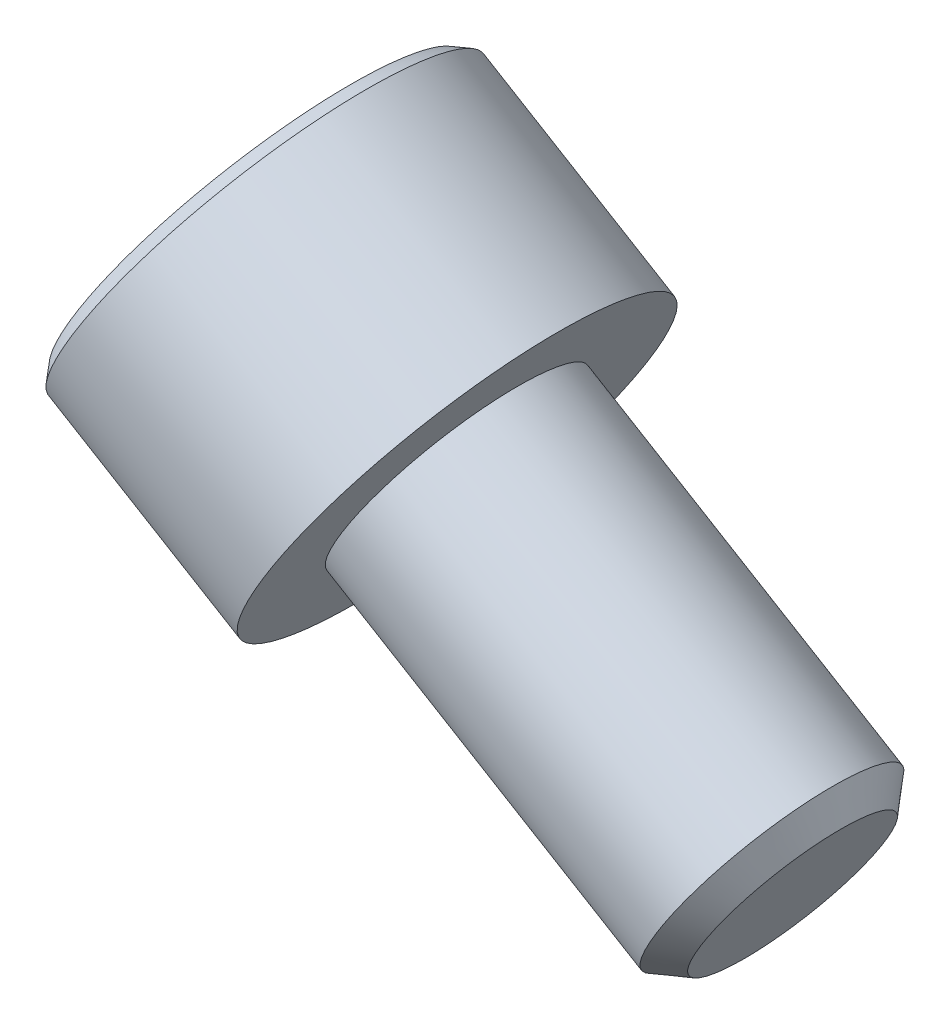
ISO-10303-21;
HEADER;
FILE_DESCRIPTION(('STEP AP214'),'2;1');
FILE_NAME('part.step','',(''),(''),'','','');
FILE_SCHEMA(('AUTOMOTIVE_DESIGN { 1 0 10303 214 1 1 1 1 }'));
ENDSEC;
DATA;
#1=APPLICATION_CONTEXT('core data for automotive mechanical design processes');
#2=APPLICATION_PROTOCOL_DEFINITION('international standard','automotive_design',2000,#1);
#3=PRODUCT_CONTEXT('',#1,'mechanical');
#4=PRODUCT('Part','Part','',(#3));
#5=PRODUCT_RELATED_PRODUCT_CATEGORY('part','',(#4));
#6=PRODUCT_DEFINITION_FORMATION('','',#4);
#7=PRODUCT_DEFINITION_CONTEXT('part definition',#1,'design');
#8=PRODUCT_DEFINITION('design','',#6,#7);
#9=PRODUCT_DEFINITION_SHAPE('','',#8);
#10=(LENGTH_UNIT() NAMED_UNIT(*) SI_UNIT(.MILLI.,.METRE.));
#11=(NAMED_UNIT(*) PLANE_ANGLE_UNIT() SI_UNIT($,.RADIAN.));
#12=(NAMED_UNIT(*) SI_UNIT($,.STERADIAN.) SOLID_ANGLE_UNIT());
#13=UNCERTAINTY_MEASURE_WITH_UNIT(LENGTH_MEASURE(1.E-05),#10,'distance_accuracy_value','');
#14=(GEOMETRIC_REPRESENTATION_CONTEXT(3) GLOBAL_UNCERTAINTY_ASSIGNED_CONTEXT((#13)) GLOBAL_UNIT_ASSIGNED_CONTEXT((#10,
#11,#12)) REPRESENTATION_CONTEXT('',''));
#15=CARTESIAN_POINT('',(0.,0.,0.));
#16=DIRECTION('',(0.,0.,1.));
#17=DIRECTION('',(1.,0.,0.));
#18=AXIS2_PLACEMENT_3D('',#15,#16,#17);
#19=CARTESIAN_POINT('',(-6.01123652224669,-13.8875856603519,0.));
#20=DIRECTION('',(-0.857167300702099,0.515038074910076,0.));
#21=DIRECTION('',(-0.515038074910076,-0.857167300702099,0.));
#22=AXIS2_PLACEMENT_3D('',#19,#20,#21);
#23=PLANE('',#22);
#24=CARTESIAN_POINT('',(-6.0112365222467,-13.887585660352,0.));
#25=DIRECTION('',(-0.857167300702099,0.515038074910076,0.));
#26=DIRECTION('',(-0.515038074910076,-0.857167300702099,0.));
#27=AXIS2_PLACEMENT_3D('',#24,#25,#26);
#28=CIRCLE('',#27,2.38649999999937);
#29=CARTESIAN_POINT('',(-7.24037488801927,-15.933215423477,0.));
#30=VERTEX_POINT('',#29);
#31=EDGE_CURVE('E375',#30,#30,#28,.T.);
#32=ORIENTED_EDGE('',*,*,#31,.F.);
#33=EDGE_LOOP('',(#32));
#34=FACE_BOUND('',#33,.T.);
#35=ADVANCED_FACE('F16',(#34),#23,.F.);
#36=CARTESIAN_POINT('',(-6.01123652224678,-13.8875856603519,0.));
#37=DIRECTION('',(-0.857167300702099,0.515038074910076,0.));
#38=DIRECTION('',(-0.515038074910076,-0.857167300702099,0.));
#39=AXIS2_PLACEMENT_3D('',#36,#37,#38);
#40=CONICAL_SURFACE('',#39,2.38649999999947,0.7853981633981);
#41=CARTESIAN_POINT('',(-6.53710866122728,-13.5716098013947,0.));
#42=DIRECTION('',(-0.857167300702099,0.515038074910076,0.));
#43=DIRECTION('',(-0.515038074910076,-0.857167300702099,0.));
#44=AXIS2_PLACEMENT_3D('',#41,#42,#43);
#45=CIRCLE('',#44,2.99999999999999);
#46=CARTESIAN_POINT('',(-8.08222288595751,-16.143111703501,0.));
#47=VERTEX_POINT('',#46);
#48=EDGE_CURVE('E372',#47,#47,#45,.T.);
#49=ORIENTED_EDGE('',*,*,#48,.F.);
#50=EDGE_LOOP('',(#49));
#51=FACE_BOUND('',#50,.T.);
#52=ORIENTED_EDGE('',*,*,#31,.T.);
#53=EDGE_LOOP('',(#52));
#54=FACE_BOUND('',#53,.T.);
#55=ADVANCED_FACE('F178',(#51,#54),#40,.T.);
#56=CARTESIAN_POINT('',(-19.72591333348,-5.6469764617909,0.));
#57=DIRECTION('',(-0.857167300702099,0.515038074910076,0.));
#58=DIRECTION('',(-0.515038074910076,-0.857167300702099,0.));
#59=AXIS2_PLACEMENT_3D('',#56,#57,#58);
#60=CYLINDRICAL_SURFACE('',#59,3.00000000000024);
#61=CARTESIAN_POINT('',(-14.5829095292675,-8.73720491125129,0.));
#62=DIRECTION('',(-0.857167300702099,0.515038074910076,0.));
#63=DIRECTION('',(-0.515038074910076,-0.857167300702099,0.));
#64=AXIS2_PLACEMENT_3D('',#61,#62,#63);
#65=CIRCLE('',#64,3.00000000000024);
#66=CARTESIAN_POINT('',(-16.1280237539979,-11.3087068133578,0.));
#67=VERTEX_POINT('',#66);
#68=EDGE_CURVE('E367',#67,#67,#65,.T.);
#69=ORIENTED_EDGE('',*,*,#68,.F.);
#70=EDGE_LOOP('',(#69));
#71=FACE_BOUND('',#70,.T.);
#72=ORIENTED_EDGE('',*,*,#48,.T.);
#73=EDGE_LOOP('',(#72));
#74=FACE_BOUND('',#73,.T.);
#75=ADVANCED_FACE('F184',(#71,#74),#60,.T.);
#76=CARTESIAN_POINT('',(-16.128023753998,-11.308706813358,0.));
#77=DIRECTION('',(-0.857167300702099,0.515038074910076,0.));
#78=DIRECTION('',(-0.515038074910076,-0.857167300702099,0.));
#79=AXIS2_PLACEMENT_3D('',#76,#77,#78);
#80=PLANE('',#79);
#81=CARTESIAN_POINT('',(-14.5829095292675,-8.73720491125129,0.));
#82=DIRECTION('',(-0.857167300702099,0.515038074910076,0.));
#83=DIRECTION('',(-0.515038074910076,-0.857167300702099,0.));
#84=AXIS2_PLACEMENT_3D('',#81,#82,#83);
#85=CIRCLE('',#84,5.00000000000043);
#86=CARTESIAN_POINT('',(-17.1580999038181,-13.0230414147622,0.));
#87=VERTEX_POINT('',#86);
#88=EDGE_CURVE('E365',#87,#87,#85,.T.);
#89=ORIENTED_EDGE('',*,*,#88,.F.);
#90=EDGE_LOOP('',(#89));
#91=FACE_BOUND('',#90,.T.);
#92=ORIENTED_EDGE('',*,*,#68,.T.);
#93=EDGE_LOOP('',(#92));
#94=FACE_BOUND('',#93,.T.);
#95=ADVANCED_FACE('F191',(#91,#94),#80,.F.);
#96=CARTESIAN_POINT('',(-19.72591333348,-5.6469764617909,0.));
#97=DIRECTION('',(-0.857167300702099,0.515038074910076,0.));
#98=DIRECTION('',(-0.515038074910076,-0.857167300702099,0.));
#99=AXIS2_PLACEMENT_3D('',#96,#97,#98);
#100=CYLINDRICAL_SURFACE('',#99,5.00000000000043);
#101=CARTESIAN_POINT('',(-19.4687631432693,-5.80148788426397,0.));
#102=DIRECTION('',(-0.857167300702099,0.515038074910076,0.));
#103=DIRECTION('',(-0.515038074910076,-0.857167300702099,0.));
#104=AXIS2_PLACEMENT_3D('',#101,#102,#103);
#105=CIRCLE('',#104,5.00000000000063);
#106=CARTESIAN_POINT('',(-22.04395351782,-10.087324387775,0.));
#107=VERTEX_POINT('',#106);
#108=EDGE_CURVE('E96',#107,#107,#105,.T.);
#109=ORIENTED_EDGE('',*,*,#108,.F.);
#110=EDGE_LOOP('',(#109));
#111=FACE_BOUND('',#110,.T.);
#112=ORIENTED_EDGE('',*,*,#88,.T.);
#113=EDGE_LOOP('',(#112));
#114=FACE_BOUND('',#113,.T.);
#115=ADVANCED_FACE('F195',(#111,#114),#100,.T.);
#116=CARTESIAN_POINT('',(-19.4687631432693,-5.80148788426397,0.));
#117=DIRECTION('',(0.857167300702099,-0.515038074910076,0.));
#118=DIRECTION('',(0.515038074910076,0.857167300702099,0.));
#119=AXIS2_PLACEMENT_3D('',#116,#117,#118);
#120=CONICAL_SURFACE('',#119,5.00000000000063,0.785398163396804);
#121=CARTESIAN_POINT('',(-19.7259133334802,-5.64697646179078,0.));
#122=DIRECTION('',(-0.857167300702099,0.515038074910076,0.));
#123=DIRECTION('',(-0.515038074910076,-0.857167300702099,0.));
#124=AXIS2_PLACEMENT_3D('',#121,#122,#123);
#125=CIRCLE('',#124,4.70000000000068);
#126=CARTESIAN_POINT('',(-22.1465922855579,-9.67566277509123,0.));
#127=VERTEX_POINT('',#126);
#128=EDGE_CURVE('E93',#127,#127,#125,.T.);
#129=ORIENTED_EDGE('',*,*,#128,.F.);
#130=EDGE_LOOP('',(#129));
#131=FACE_BOUND('',#130,.T.);
#132=ORIENTED_EDGE('',*,*,#108,.T.);
#133=EDGE_LOOP('',(#132));
#134=FACE_BOUND('',#133,.T.);
#135=ADVANCED_FACE('F199',(#131,#134),#120,.T.);
#136=CARTESIAN_POINT('',(-22.1465922855578,-9.67566277509102,0.));
#137=DIRECTION('',(0.857167300702099,-0.515038074910076,0.));
#138=DIRECTION('',(0.515038074910076,0.857167300702099,0.));
#139=AXIS2_PLACEMENT_3D('',#136,#137,#138);
#140=PLANE('',#139);
#141=DIRECTION('',(0.,0.,-1.));
#142=VECTOR('',#141,1.);
#143=CARTESIAN_POINT('',(-21.0135085207554,-7.78989471354601,1.4433756729741));
#144=LINE('',#143,#142);
#145=CARTESIAN_POINT('',(-21.0135085207552,-7.78989471354618,1.4433756729741));
#146=VERTEX_POINT('',#145);
#147=CARTESIAN_POINT('',(-21.0135085207552,-7.78989471354618,-1.4433756729741));
#148=VERTEX_POINT('',#147);
#149=EDGE_CURVE('E78',#146,#148,#144,.T.);
#150=ORIENTED_EDGE('',*,*,#149,.T.);
#151=DIRECTION('',(-0.446036056788342,-0.742328657701373,0.499999999999985));
#152=VECTOR('',#151,1.);
#153=CARTESIAN_POINT('',(-19.72591333348,-5.6469764617909,-2.8867513459481));
#154=LINE('',#153,#152);
#155=CARTESIAN_POINT('',(-19.72591333348,-5.6469764617909,-2.8867513459481));
#156=VERTEX_POINT('',#155);
#157=EDGE_CURVE('E67',#156,#148,#154,.T.);
#158=ORIENTED_EDGE('',*,*,#157,.F.);
#159=DIRECTION('',(-0.446036056788342,-0.742328657701373,-0.499999999999985));
#160=VECTOR('',#159,1.);
#161=CARTESIAN_POINT('',(-18.4383181462049,-3.50405821003563,-1.4433756729741));
#162=LINE('',#161,#160);
#163=CARTESIAN_POINT('',(-18.4383181462049,-3.50405821003563,-1.4433756729741));
#164=VERTEX_POINT('',#163);
#165=EDGE_CURVE('E77',#164,#156,#162,.T.);
#166=ORIENTED_EDGE('',*,*,#165,.F.);
#167=DIRECTION('',(0.,0.,-1.));
#168=VECTOR('',#167,1.);
#169=CARTESIAN_POINT('',(-18.4383181462049,-3.50405821003563,1.4433756729741));
#170=LINE('',#169,#168);
#171=CARTESIAN_POINT('',(-18.4383181462049,-3.50405821003563,1.4433756729741));
#172=VERTEX_POINT('',#171);
#173=EDGE_CURVE('E105',#172,#164,#170,.T.);
#174=ORIENTED_EDGE('',*,*,#173,.F.);
#175=DIRECTION('',(0.446036056788342,0.742328657701373,-0.499999999999985));
#176=VECTOR('',#175,1.);
#177=CARTESIAN_POINT('',(-19.72591333348,-5.6469764617909,2.8867513459481));
#178=LINE('',#177,#176);
#179=CARTESIAN_POINT('',(-19.7259133334802,-5.64697646179078,2.8867513459481));
#180=VERTEX_POINT('',#179);
#181=EDGE_CURVE('E109',#180,#172,#178,.T.);
#182=ORIENTED_EDGE('',*,*,#181,.F.);
#183=DIRECTION('',(0.446036056788342,0.742328657701373,0.499999999999985));
#184=VECTOR('',#183,1.);
#185=CARTESIAN_POINT('',(-21.0135085207552,-7.78989471354618,1.4433756729741));
#186=LINE('',#185,#184);
#187=EDGE_CURVE('E87',#146,#180,#186,.T.);
#188=ORIENTED_EDGE('',*,*,#187,.F.);
#189=EDGE_LOOP('',(#150,#158,#166,#174,#182,#188));
#190=FACE_BOUND('',#189,.T.);
#191=ORIENTED_EDGE('',*,*,#128,.T.);
#192=EDGE_LOOP('',(#191));
#193=FACE_BOUND('',#192,.T.);
#194=ADVANCED_FACE('F90',(#190,#193),#140,.F.);
#195=CARTESIAN_POINT('',(-18.4420066186488,-9.33500893827633,-1.4433756729741));
#196=DIRECTION('',(-0.515038074910052,-0.857167300702114,0.));
#197=DIRECTION('',(0.857167300702114,-0.515038074910052,0.));
#198=AXIS2_PLACEMENT_3D('',#195,#196,#197);
#199=PLANE('',#198);
#200=DIRECTION('',(-0.857167300702113,0.515038074910053,0.));
#201=VECTOR('',#200,1.);
#202=CARTESIAN_POINT('',(-18.4420066186488,-9.33500893827633,-1.4433756729741));
#203=LINE('',#202,#201);
#204=CARTESIAN_POINT('',(-18.4420066186488,-9.33500893827633,-1.4433756729741));
#205=VERTEX_POINT('',#204);
#206=EDGE_CURVE('E71',#205,#148,#203,.T.);
#207=ORIENTED_EDGE('',*,*,#206,.T.);
#208=ORIENTED_EDGE('',*,*,#149,.F.);
#209=DIRECTION('',(-0.857167300702113,0.515038074910053,0.));
#210=VECTOR('',#209,1.);
#211=CARTESIAN_POINT('',(-18.4420066186488,-9.33500893827633,1.4433756729741));
#212=LINE('',#211,#210);
#213=CARTESIAN_POINT('',(-18.4420066186488,-9.33500893827633,1.4433756729741));
#214=VERTEX_POINT('',#213);
#215=EDGE_CURVE('E86',#214,#146,#212,.T.);
#216=ORIENTED_EDGE('',*,*,#215,.F.);
#217=DIRECTION('',(0.,0.,1.));
#218=VECTOR('',#217,1.);
#219=CARTESIAN_POINT('',(-18.4420066186488,-9.33500893827633,-1.4433756729741));
#220=LINE('',#219,#218);
#221=EDGE_CURVE('E85',#205,#214,#220,.T.);
#222=ORIENTED_EDGE('',*,*,#221,.F.);
#223=EDGE_LOOP('',(#207,#208,#216,#222));
#224=FACE_BOUND('',#223,.T.);
#225=ADVANCED_FACE('F83',(#224),#199,.F.);
#226=CARTESIAN_POINT('',(-17.1544114313736,-7.19209068652106,-2.8867513459481));
#227=DIRECTION('',(-0.257519037455019,-0.428583650351044,-0.866025403784447));
#228=DIRECTION('',(0.,0.896253131495126,-0.44354292270893));
#229=AXIS2_PLACEMENT_3D('',#226,#227,#228);
#230=PLANE('',#229);
#231=ORIENTED_EDGE('',*,*,#157,.T.);
#232=ORIENTED_EDGE('',*,*,#206,.F.);
#233=DIRECTION('',(-0.446036056788342,-0.742328657701373,0.499999999999985));
#234=VECTOR('',#233,1.);
#235=CARTESIAN_POINT('',(-17.1544114313736,-7.19209068652106,-2.8867513459481));
#236=LINE('',#235,#234);
#237=CARTESIAN_POINT('',(-17.1544114313736,-7.19209068652106,-2.8867513459481));
#238=VERTEX_POINT('',#237);
#239=EDGE_CURVE('E124',#238,#205,#236,.T.);
#240=ORIENTED_EDGE('',*,*,#239,.F.);
#241=DIRECTION('',(-0.857167300702114,0.515038074910052,0.));
#242=VECTOR('',#241,1.);
#243=CARTESIAN_POINT('',(-17.1544114313736,-7.19209068652106,-2.8867513459481));
#244=LINE('',#243,#242);
#245=EDGE_CURVE('E73',#238,#156,#244,.T.);
#246=ORIENTED_EDGE('',*,*,#245,.T.);
#247=EDGE_LOOP('',(#231,#232,#240,#246));
#248=FACE_BOUND('',#247,.T.);
#249=ADVANCED_FACE('F69',(#248),#230,.F.);
#250=CARTESIAN_POINT('',(-15.8668162440985,-5.04917243476578,-1.4433756729741));
#251=DIRECTION('',(0.257519037455019,0.428583650351044,-0.866025403784447));
#252=DIRECTION('',(0.,0.896253131495126,0.44354292270893));
#253=AXIS2_PLACEMENT_3D('',#250,#251,#252);
#254=PLANE('',#253);
#255=ORIENTED_EDGE('',*,*,#165,.T.);
#256=ORIENTED_EDGE('',*,*,#245,.F.);
#257=DIRECTION('',(-0.446036056788342,-0.742328657701373,-0.499999999999985));
#258=VECTOR('',#257,1.);
#259=CARTESIAN_POINT('',(-15.8668162440985,-5.04917243476578,-1.4433756729741));
#260=LINE('',#259,#258);
#261=CARTESIAN_POINT('',(-15.8668162440985,-5.04917243476578,-1.4433756729741));
#262=VERTEX_POINT('',#261);
#263=EDGE_CURVE('E131',#262,#238,#260,.T.);
#264=ORIENTED_EDGE('',*,*,#263,.F.);
#265=DIRECTION('',(-0.857167300702113,0.515038074910052,0.));
#266=VECTOR('',#265,1.);
#267=CARTESIAN_POINT('',(-15.8668162440985,-5.04917243476578,-1.4433756729741));
#268=LINE('',#267,#266);
#269=EDGE_CURVE('E135',#262,#164,#268,.T.);
#270=ORIENTED_EDGE('',*,*,#269,.T.);
#271=EDGE_LOOP('',(#255,#256,#264,#270));
#272=FACE_BOUND('',#271,.T.);
#273=ADVANCED_FACE('F168',(#272),#254,.F.);
#274=CARTESIAN_POINT('',(-15.8668162440985,-5.04917243476578,1.4433756729741));
#275=DIRECTION('',(0.515038074910052,0.857167300702114,0.));
#276=DIRECTION('',(-0.857167300702114,0.515038074910052,0.));
#277=AXIS2_PLACEMENT_3D('',#274,#275,#276);
#278=PLANE('',#277);
#279=ORIENTED_EDGE('',*,*,#173,.T.);
#280=ORIENTED_EDGE('',*,*,#269,.F.);
#281=DIRECTION('',(0.,0.,-1.));
#282=VECTOR('',#281,1.);
#283=CARTESIAN_POINT('',(-15.8668162440985,-5.04917243476578,1.4433756729741));
#284=LINE('',#283,#282);
#285=CARTESIAN_POINT('',(-15.8668162440985,-5.04917243476578,1.4433756729741));
#286=VERTEX_POINT('',#285);
#287=EDGE_CURVE('E140',#286,#262,#284,.T.);
#288=ORIENTED_EDGE('',*,*,#287,.F.);
#289=DIRECTION('',(-0.857167300702113,0.515038074910052,0.));
#290=VECTOR('',#289,1.);
#291=CARTESIAN_POINT('',(-15.8668162440985,-5.04917243476578,1.4433756729741));
#292=LINE('',#291,#290);
#293=EDGE_CURVE('E144',#286,#172,#292,.T.);
#294=ORIENTED_EDGE('',*,*,#293,.T.);
#295=EDGE_LOOP('',(#279,#280,#288,#294));
#296=FACE_BOUND('',#295,.T.);
#297=ADVANCED_FACE('F165',(#296),#278,.F.);
#298=CARTESIAN_POINT('',(-17.1544114313736,-7.19209068652106,2.8867513459481));
#299=DIRECTION('',(0.257519037455019,0.428583650351044,0.866025403784447));
#300=DIRECTION('',(0.,-0.896253131495126,0.44354292270893));
#301=AXIS2_PLACEMENT_3D('',#298,#299,#300);
#302=PLANE('',#301);
#303=ORIENTED_EDGE('',*,*,#181,.T.);
#304=ORIENTED_EDGE('',*,*,#293,.F.);
#305=DIRECTION('',(0.446036056788342,0.742328657701373,-0.499999999999985));
#306=VECTOR('',#305,1.);
#307=CARTESIAN_POINT('',(-17.1544114313736,-7.19209068652106,2.8867513459481));
#308=LINE('',#307,#306);
#309=CARTESIAN_POINT('',(-17.1544114313736,-7.19209068652106,2.8867513459481));
#310=VERTEX_POINT('',#309);
#311=EDGE_CURVE('E34',#310,#286,#308,.T.);
#312=ORIENTED_EDGE('',*,*,#311,.F.);
#313=DIRECTION('',(-0.857167300702113,0.515038074910052,0.));
#314=VECTOR('',#313,1.);
#315=CARTESIAN_POINT('',(-17.1544114313736,-7.19209068652106,2.8867513459481));
#316=LINE('',#315,#314);
#317=EDGE_CURVE('E25',#310,#180,#316,.T.);
#318=ORIENTED_EDGE('',*,*,#317,.T.);
#319=EDGE_LOOP('',(#303,#304,#312,#318));
#320=FACE_BOUND('',#319,.T.);
#321=ADVANCED_FACE('F159',(#320),#302,.F.);
#322=CARTESIAN_POINT('',(-18.4420066186488,-9.33500893827633,1.4433756729741));
#323=DIRECTION('',(-0.257519037455019,-0.428583650351044,0.866025403784447));
#324=DIRECTION('',(0.,-0.896253131495126,-0.44354292270893));
#325=AXIS2_PLACEMENT_3D('',#322,#323,#324);
#326=PLANE('',#325);
#327=ORIENTED_EDGE('',*,*,#187,.T.);
#328=ORIENTED_EDGE('',*,*,#317,.F.);
#329=DIRECTION('',(0.446036056788342,0.742328657701373,0.499999999999985));
#330=VECTOR('',#329,1.);
#331=CARTESIAN_POINT('',(-18.4420066186488,-9.33500893827633,1.4433756729741));
#332=LINE('',#331,#330);
#333=EDGE_CURVE('E11',#214,#310,#332,.T.);
#334=ORIENTED_EDGE('',*,*,#333,.F.);
#335=ORIENTED_EDGE('',*,*,#215,.T.);
#336=EDGE_LOOP('',(#327,#328,#334,#335));
#337=FACE_BOUND('',#336,.T.);
#338=ADVANCED_FACE('F169',(#337),#326,.F.);
#339=CARTESIAN_POINT('',(-9.42884030772301,5.66541882401043,0.));
#340=DIRECTION('',(-0.857167300702114,0.515038074910052,0.));
#341=DIRECTION('',(-0.515038074910052,-0.857167300702114,0.));
#342=AXIS2_PLACEMENT_3D('',#339,#340,#341);
#343=PLANE('',#342);
#344=ORIENTED_EDGE('',*,*,#287,.T.);
#345=ORIENTED_EDGE('',*,*,#263,.T.);
#346=ORIENTED_EDGE('',*,*,#239,.T.);
#347=ORIENTED_EDGE('',*,*,#221,.T.);
#348=ORIENTED_EDGE('',*,*,#333,.T.);
#349=ORIENTED_EDGE('',*,*,#311,.T.);
#350=EDGE_LOOP('',(#344,#345,#346,#347,#348,#349));
#351=FACE_BOUND('',#350,.T.);
#352=ADVANCED_FACE('F18',(#351),#343,.T.);
#353=CLOSED_SHELL('',(#35,#55,#75,#95,#115,#135,#194,#225,#249,#273,#297,#321,#338,#352));
#354=MANIFOLD_SOLID_BREP('B1',#353);
#355=ADVANCED_BREP_SHAPE_REPRESENTATION('',(#18,#354),#14);
#356=SHAPE_DEFINITION_REPRESENTATION(#9,#355);
ENDSEC;
END-ISO-10303-21;
